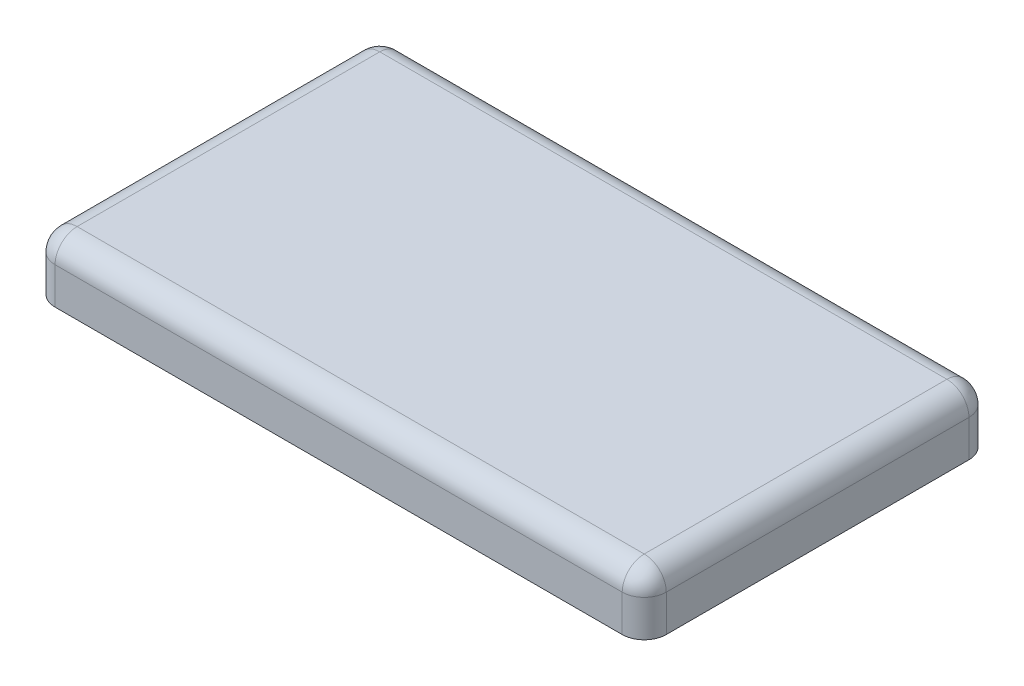
ISO-10303-21;
HEADER;
FILE_DESCRIPTION(('STEP AP214'),'2;1');
FILE_NAME('part.step','',(''),(''),'','','');
FILE_SCHEMA(('AUTOMOTIVE_DESIGN { 1 0 10303 214 1 1 1 1 }'));
ENDSEC;
DATA;
#1=APPLICATION_CONTEXT('core data for automotive mechanical design processes');
#2=APPLICATION_PROTOCOL_DEFINITION('international standard','automotive_design',2000,#1);
#3=PRODUCT_CONTEXT('',#1,'mechanical');
#4=PRODUCT('Part','Part','',(#3));
#5=PRODUCT_RELATED_PRODUCT_CATEGORY('part','',(#4));
#6=PRODUCT_DEFINITION_FORMATION('','',#4);
#7=PRODUCT_DEFINITION_CONTEXT('part definition',#1,'design');
#8=PRODUCT_DEFINITION('design','',#6,#7);
#9=PRODUCT_DEFINITION_SHAPE('','',#8);
#10=(LENGTH_UNIT() NAMED_UNIT(*) SI_UNIT(.MILLI.,.METRE.));
#11=(NAMED_UNIT(*) PLANE_ANGLE_UNIT() SI_UNIT($,.RADIAN.));
#12=(NAMED_UNIT(*) SI_UNIT($,.STERADIAN.) SOLID_ANGLE_UNIT());
#13=UNCERTAINTY_MEASURE_WITH_UNIT(LENGTH_MEASURE(1.E-05),#10,'distance_accuracy_value','');
#14=(GEOMETRIC_REPRESENTATION_CONTEXT(3) GLOBAL_UNCERTAINTY_ASSIGNED_CONTEXT((#13)) GLOBAL_UNIT_ASSIGNED_CONTEXT((#10,
#11,#12)) REPRESENTATION_CONTEXT('',''));
#15=CARTESIAN_POINT('',(0.,0.,0.));
#16=DIRECTION('',(0.,0.,1.));
#17=DIRECTION('',(1.,0.,0.));
#18=AXIS2_PLACEMENT_3D('',#15,#16,#17);
#19=CARTESIAN_POINT('',(0.,4.,0.));
#20=DIRECTION('',(1.,0.,0.));
#21=DIRECTION('',(0.,0.,-1.));
#22=AXIS2_PLACEMENT_3D('',#19,#20,#21);
#23=PLANE('',#22);
#24=DIRECTION('',(0.,0.,1.));
#25=VECTOR('',#24,1.);
#26=CARTESIAN_POINT('',(0.,0.,0.));
#27=LINE('',#26,#25);
#28=CARTESIAN_POINT('',(0.,0.,-22.1));
#29=VERTEX_POINT('',#28);
#30=CARTESIAN_POINT('',(0.,0.,-1.5));
#31=VERTEX_POINT('',#30);
#32=EDGE_CURVE('E176',#29,#31,#27,.T.);
#33=ORIENTED_EDGE('',*,*,#32,.T.);
#34=DIRECTION('',(0.,-1.,0.));
#35=VECTOR('',#34,1.);
#36=CARTESIAN_POINT('',(0.,4.,-1.5));
#37=LINE('',#36,#35);
#38=CARTESIAN_POINT('',(0.,2.5,-1.5));
#39=VERTEX_POINT('',#38);
#40=EDGE_CURVE('E52',#31,#39,#37,.F.);
#41=ORIENTED_EDGE('',*,*,#40,.T.);
#42=DIRECTION('',(0.,0.,1.));
#43=VECTOR('',#42,1.);
#44=CARTESIAN_POINT('',(0.,2.5,0.));
#45=LINE('',#44,#43);
#46=CARTESIAN_POINT('',(0.,2.5,-22.1));
#47=VERTEX_POINT('',#46);
#48=EDGE_CURVE('E57',#39,#47,#45,.F.);
#49=ORIENTED_EDGE('',*,*,#48,.T.);
#50=DIRECTION('',(0.,-1.,0.));
#51=VECTOR('',#50,1.);
#52=CARTESIAN_POINT('',(0.,4.,-22.1));
#53=LINE('',#52,#51);
#54=EDGE_CURVE('E218',#47,#29,#53,.T.);
#55=ORIENTED_EDGE('',*,*,#54,.T.);
#56=EDGE_LOOP('',(#33,#41,#49,#55));
#57=FACE_BOUND('',#56,.T.);
#58=ADVANCED_FACE('F35',(#57),#23,.F.);
#59=CARTESIAN_POINT('',(0.,4.,0.));
#60=DIRECTION('',(0.,0.,-1.));
#61=DIRECTION('',(-1.,0.,0.));
#62=AXIS2_PLACEMENT_3D('',#59,#60,#61);
#63=PLANE('',#62);
#64=DIRECTION('',(1.,0.,0.));
#65=VECTOR('',#64,1.);
#66=CARTESIAN_POINT('',(0.,2.5,0.));
#67=LINE('',#66,#65);
#68=CARTESIAN_POINT('',(40.1,2.5,0.));
#69=VERTEX_POINT('',#68);
#70=CARTESIAN_POINT('',(1.5,2.5,0.));
#71=VERTEX_POINT('',#70);
#72=EDGE_CURVE('E214',#69,#71,#67,.F.);
#73=ORIENTED_EDGE('',*,*,#72,.T.);
#74=DIRECTION('',(0.,-1.,0.));
#75=VECTOR('',#74,1.);
#76=CARTESIAN_POINT('',(1.5,4.,0.));
#77=LINE('',#76,#75);
#78=CARTESIAN_POINT('',(1.5,0.,0.));
#79=VERTEX_POINT('',#78);
#80=EDGE_CURVE('E216',#71,#79,#77,.T.);
#81=ORIENTED_EDGE('',*,*,#80,.T.);
#82=DIRECTION('',(1.,0.,0.));
#83=VECTOR('',#82,1.);
#84=CARTESIAN_POINT('',(0.,0.,0.));
#85=LINE('',#84,#83);
#86=CARTESIAN_POINT('',(40.1,0.,0.));
#87=VERTEX_POINT('',#86);
#88=EDGE_CURVE('E181',#79,#87,#85,.T.);
#89=ORIENTED_EDGE('',*,*,#88,.T.);
#90=DIRECTION('',(0.,-1.,0.));
#91=VECTOR('',#90,1.);
#92=CARTESIAN_POINT('',(40.1,4.,0.));
#93=LINE('',#92,#91);
#94=EDGE_CURVE('E212',#87,#69,#93,.F.);
#95=ORIENTED_EDGE('',*,*,#94,.T.);
#96=EDGE_LOOP('',(#73,#81,#89,#95));
#97=FACE_BOUND('',#96,.T.);
#98=ADVANCED_FACE('F283',(#97),#63,.F.);
#99=CARTESIAN_POINT('',(41.6,4.,0.));
#100=DIRECTION('',(-1.,0.,0.));
#101=DIRECTION('',(0.,0.,1.));
#102=AXIS2_PLACEMENT_3D('',#99,#100,#101);
#103=PLANE('',#102);
#104=DIRECTION('',(0.,0.,-1.));
#105=VECTOR('',#104,1.);
#106=CARTESIAN_POINT('',(41.6,0.,0.));
#107=LINE('',#106,#105);
#108=CARTESIAN_POINT('',(41.6,0.,-1.5));
#109=VERTEX_POINT('',#108);
#110=CARTESIAN_POINT('',(41.6,0.,-22.1));
#111=VERTEX_POINT('',#110);
#112=EDGE_CURVE('E184',#109,#111,#107,.T.);
#113=ORIENTED_EDGE('',*,*,#112,.T.);
#114=DIRECTION('',(0.,-1.,0.));
#115=VECTOR('',#114,1.);
#116=CARTESIAN_POINT('',(41.6,4.,-22.1));
#117=LINE('',#116,#115);
#118=CARTESIAN_POINT('',(41.6,2.5,-22.1));
#119=VERTEX_POINT('',#118);
#120=EDGE_CURVE('E210',#111,#119,#117,.F.);
#121=ORIENTED_EDGE('',*,*,#120,.T.);
#122=DIRECTION('',(0.,0.,-1.));
#123=VECTOR('',#122,1.);
#124=CARTESIAN_POINT('',(41.6,2.5,0.));
#125=LINE('',#124,#123);
#126=CARTESIAN_POINT('',(41.6,2.5,-1.5));
#127=VERTEX_POINT('',#126);
#128=EDGE_CURVE('E208',#119,#127,#125,.F.);
#129=ORIENTED_EDGE('',*,*,#128,.T.);
#130=DIRECTION('',(0.,-1.,0.));
#131=VECTOR('',#130,1.);
#132=CARTESIAN_POINT('',(41.6,4.,-1.5));
#133=LINE('',#132,#131);
#134=EDGE_CURVE('E206',#127,#109,#133,.T.);
#135=ORIENTED_EDGE('',*,*,#134,.T.);
#136=EDGE_LOOP('',(#113,#121,#129,#135));
#137=FACE_BOUND('',#136,.T.);
#138=ADVANCED_FACE('F316',(#137),#103,.F.);
#139=CARTESIAN_POINT('',(0.,4.,-23.6));
#140=DIRECTION('',(0.,0.,1.));
#141=DIRECTION('',(1.,0.,0.));
#142=AXIS2_PLACEMENT_3D('',#139,#140,#141);
#143=PLANE('',#142);
#144=DIRECTION('',(-1.,0.,0.));
#145=VECTOR('',#144,1.);
#146=CARTESIAN_POINT('',(0.,0.,-23.6));
#147=LINE('',#146,#145);
#148=CARTESIAN_POINT('',(40.1,0.,-23.6));
#149=VERTEX_POINT('',#148);
#150=CARTESIAN_POINT('',(1.49999999999999,0.,-23.6));
#151=VERTEX_POINT('',#150);
#152=EDGE_CURVE('E187',#149,#151,#147,.T.);
#153=ORIENTED_EDGE('',*,*,#152,.T.);
#154=DIRECTION('',(0.,-1.,0.));
#155=VECTOR('',#154,1.);
#156=CARTESIAN_POINT('',(1.49999999999999,4.,-23.6));
#157=LINE('',#156,#155);
#158=CARTESIAN_POINT('',(1.49999999999999,2.5,-23.6));
#159=VERTEX_POINT('',#158);
#160=EDGE_CURVE('E204',#151,#159,#157,.F.);
#161=ORIENTED_EDGE('',*,*,#160,.T.);
#162=DIRECTION('',(-1.,0.,0.));
#163=VECTOR('',#162,1.);
#164=CARTESIAN_POINT('',(0.,2.5,-23.6));
#165=LINE('',#164,#163);
#166=CARTESIAN_POINT('',(40.1,2.5,-23.6));
#167=VERTEX_POINT('',#166);
#168=EDGE_CURVE('E201',#159,#167,#165,.F.);
#169=ORIENTED_EDGE('',*,*,#168,.T.);
#170=DIRECTION('',(0.,-1.,0.));
#171=VECTOR('',#170,1.);
#172=CARTESIAN_POINT('',(40.1,4.,-23.6));
#173=LINE('',#172,#171);
#174=EDGE_CURVE('E199',#167,#149,#173,.T.);
#175=ORIENTED_EDGE('',*,*,#174,.T.);
#176=EDGE_LOOP('',(#153,#161,#169,#175));
#177=FACE_BOUND('',#176,.T.);
#178=ADVANCED_FACE('F307',(#177),#143,.F.);
#179=CARTESIAN_POINT('',(0.,4.,0.));
#180=DIRECTION('',(0.,-1.,0.));
#181=DIRECTION('',(0.,0.,-1.));
#182=AXIS2_PLACEMENT_3D('',#179,#180,#181);
#183=PLANE('',#182);
#184=DIRECTION('',(0.,0.,-1.));
#185=VECTOR('',#184,1.);
#186=CARTESIAN_POINT('',(40.1,4.,0.));
#187=LINE('',#186,#185);
#188=CARTESIAN_POINT('',(40.1,4.,-1.5));
#189=VERTEX_POINT('',#188);
#190=CARTESIAN_POINT('',(40.1,4.,-22.1));
#191=VERTEX_POINT('',#190);
#192=EDGE_CURVE('E194',#189,#191,#187,.T.);
#193=ORIENTED_EDGE('',*,*,#192,.T.);
#194=DIRECTION('',(-1.,0.,0.));
#195=VECTOR('',#194,1.);
#196=CARTESIAN_POINT('',(0.,4.,-22.1));
#197=LINE('',#196,#195);
#198=CARTESIAN_POINT('',(1.49999999999999,4.,-22.1));
#199=VERTEX_POINT('',#198);
#200=EDGE_CURVE('E196',#191,#199,#197,.T.);
#201=ORIENTED_EDGE('',*,*,#200,.T.);
#202=DIRECTION('',(0.,0.,1.));
#203=VECTOR('',#202,1.);
#204=CARTESIAN_POINT('',(1.5,4.,0.));
#205=LINE('',#204,#203);
#206=CARTESIAN_POINT('',(1.5,4.,-1.5));
#207=VERTEX_POINT('',#206);
#208=EDGE_CURVE('E190',#199,#207,#205,.T.);
#209=ORIENTED_EDGE('',*,*,#208,.T.);
#210=DIRECTION('',(1.,0.,0.));
#211=VECTOR('',#210,1.);
#212=CARTESIAN_POINT('',(0.,4.,-1.5));
#213=LINE('',#212,#211);
#214=EDGE_CURVE('E192',#207,#189,#213,.T.);
#215=ORIENTED_EDGE('',*,*,#214,.T.);
#216=EDGE_LOOP('',(#193,#201,#209,#215));
#217=FACE_BOUND('',#216,.T.);
#218=ADVANCED_FACE('F273',(#217),#183,.F.);
#219=CARTESIAN_POINT('',(0.,0.,0.));
#220=DIRECTION('',(0.,-1.,0.));
#221=DIRECTION('',(0.,0.,-1.));
#222=AXIS2_PLACEMENT_3D('',#219,#220,#221);
#223=PLANE('',#222);
#224=DIRECTION('',(0.,0.,1.));
#225=VECTOR('',#224,1.);
#226=CARTESIAN_POINT('',(40.3,0.,-22.3));
#227=LINE('',#226,#225);
#228=CARTESIAN_POINT('',(40.3,0.,-22.3));
#229=VERTEX_POINT('',#228);
#230=CARTESIAN_POINT('',(40.3,0.,-1.3));
#231=VERTEX_POINT('',#230);
#232=EDGE_CURVE('E144',#229,#231,#227,.T.);
#233=ORIENTED_EDGE('',*,*,#232,.F.);
#234=DIRECTION('',(1.,0.,0.));
#235=VECTOR('',#234,1.);
#236=CARTESIAN_POINT('',(1.29999999999999,0.,-22.3));
#237=LINE('',#236,#235);
#238=CARTESIAN_POINT('',(1.29999999999999,0.,-22.3));
#239=VERTEX_POINT('',#238);
#240=EDGE_CURVE('E161',#239,#229,#237,.T.);
#241=ORIENTED_EDGE('',*,*,#240,.F.);
#242=DIRECTION('',(0.,0.,-1.));
#243=VECTOR('',#242,1.);
#244=CARTESIAN_POINT('',(1.29999999999999,0.,-22.3));
#245=LINE('',#244,#243);
#246=CARTESIAN_POINT('',(1.29999999999999,0.,-1.3));
#247=VERTEX_POINT('',#246);
#248=EDGE_CURVE('E164',#247,#239,#245,.T.);
#249=ORIENTED_EDGE('',*,*,#248,.F.);
#250=DIRECTION('',(-1.,0.,0.));
#251=VECTOR('',#250,1.);
#252=CARTESIAN_POINT('',(1.29999999999999,0.,-1.3));
#253=LINE('',#252,#251);
#254=EDGE_CURVE('E170',#231,#247,#253,.T.);
#255=ORIENTED_EDGE('',*,*,#254,.F.);
#256=EDGE_LOOP('',(#233,#241,#249,#255));
#257=FACE_BOUND('',#256,.T.);
#258=ORIENTED_EDGE('',*,*,#88,.F.);
#259=CARTESIAN_POINT('',(1.5,0.,-1.5));
#260=DIRECTION('',(0.,-1.,0.));
#261=DIRECTION('',(0.,0.,-1.));
#262=AXIS2_PLACEMENT_3D('',#259,#260,#261);
#263=CIRCLE('',#262,1.5);
#264=EDGE_CURVE('E11',#79,#31,#263,.T.);
#265=ORIENTED_EDGE('',*,*,#264,.T.);
#266=ORIENTED_EDGE('',*,*,#32,.F.);
#267=CARTESIAN_POINT('',(1.49999999999999,0.,-22.1));
#268=DIRECTION('',(0.,-1.,0.));
#269=DIRECTION('',(0.,0.,-1.));
#270=AXIS2_PLACEMENT_3D('',#267,#268,#269);
#271=CIRCLE('',#270,1.5);
#272=EDGE_CURVE('E44',#29,#151,#271,.T.);
#273=ORIENTED_EDGE('',*,*,#272,.T.);
#274=ORIENTED_EDGE('',*,*,#152,.F.);
#275=CARTESIAN_POINT('',(40.1,0.,-22.1));
#276=DIRECTION('',(0.,-1.,0.));
#277=DIRECTION('',(0.,0.,-1.));
#278=AXIS2_PLACEMENT_3D('',#275,#276,#277);
#279=CIRCLE('',#278,1.5);
#280=EDGE_CURVE('E224',#149,#111,#279,.T.);
#281=ORIENTED_EDGE('',*,*,#280,.T.);
#282=ORIENTED_EDGE('',*,*,#112,.F.);
#283=CARTESIAN_POINT('',(40.1,0.,-1.5));
#284=DIRECTION('',(0.,-1.,0.));
#285=DIRECTION('',(0.,0.,-1.));
#286=AXIS2_PLACEMENT_3D('',#283,#284,#285);
#287=CIRCLE('',#286,1.5);
#288=EDGE_CURVE('E222',#109,#87,#287,.T.);
#289=ORIENTED_EDGE('',*,*,#288,.T.);
#290=EDGE_LOOP('',(#258,#265,#266,#273,#274,#281,#282,#289));
#291=FACE_BOUND('',#290,.T.);
#292=ADVANCED_FACE('F291',(#257,#291),#223,.T.);
#293=CARTESIAN_POINT('',(40.3,2.6,-22.3));
#294=DIRECTION('',(1.,0.,0.));
#295=DIRECTION('',(0.,0.,-1.));
#296=AXIS2_PLACEMENT_3D('',#293,#294,#295);
#297=PLANE('',#296);
#298=ORIENTED_EDGE('',*,*,#232,.T.);
#299=DIRECTION('',(0.,-1.,0.));
#300=VECTOR('',#299,1.);
#301=CARTESIAN_POINT('',(40.3,2.6,-1.3));
#302=LINE('',#301,#300);
#303=CARTESIAN_POINT('',(40.3,2.6,-1.3));
#304=VERTEX_POINT('',#303);
#305=EDGE_CURVE('E137',#304,#231,#302,.T.);
#306=ORIENTED_EDGE('',*,*,#305,.F.);
#307=DIRECTION('',(0.,0.,1.));
#308=VECTOR('',#307,1.);
#309=CARTESIAN_POINT('',(40.3,2.6,-22.3));
#310=LINE('',#309,#308);
#311=CARTESIAN_POINT('',(40.3,2.6,-22.3));
#312=VERTEX_POINT('',#311);
#313=EDGE_CURVE('E141',#312,#304,#310,.T.);
#314=ORIENTED_EDGE('',*,*,#313,.F.);
#315=DIRECTION('',(0.,-1.,0.));
#316=VECTOR('',#315,1.);
#317=CARTESIAN_POINT('',(40.3,2.6,-22.3));
#318=LINE('',#317,#316);
#319=EDGE_CURVE('E174',#312,#229,#318,.T.);
#320=ORIENTED_EDGE('',*,*,#319,.T.);
#321=EDGE_LOOP('',(#298,#306,#314,#320));
#322=FACE_BOUND('',#321,.T.);
#323=ADVANCED_FACE('F139',(#322),#297,.F.);
#324=CARTESIAN_POINT('',(1.29999999999999,2.6,-22.3));
#325=DIRECTION('',(0.,0.,-1.));
#326=DIRECTION('',(-1.,0.,0.));
#327=AXIS2_PLACEMENT_3D('',#324,#325,#326);
#328=PLANE('',#327);
#329=ORIENTED_EDGE('',*,*,#240,.T.);
#330=ORIENTED_EDGE('',*,*,#319,.F.);
#331=DIRECTION('',(1.,0.,0.));
#332=VECTOR('',#331,1.);
#333=CARTESIAN_POINT('',(1.29999999999999,2.6,-22.3));
#334=LINE('',#333,#332);
#335=CARTESIAN_POINT('',(1.29999999999999,2.6,-22.3));
#336=VERTEX_POINT('',#335);
#337=EDGE_CURVE('E149',#336,#312,#334,.T.);
#338=ORIENTED_EDGE('',*,*,#337,.F.);
#339=DIRECTION('',(0.,-1.,0.));
#340=VECTOR('',#339,1.);
#341=CARTESIAN_POINT('',(1.29999999999999,2.6,-22.3));
#342=LINE('',#341,#340);
#343=EDGE_CURVE('E177',#336,#239,#342,.T.);
#344=ORIENTED_EDGE('',*,*,#343,.T.);
#345=EDGE_LOOP('',(#329,#330,#338,#344));
#346=FACE_BOUND('',#345,.T.);
#347=ADVANCED_FACE('F445',(#346),#328,.F.);
#348=CARTESIAN_POINT('',(1.29999999999999,2.6,-22.3));
#349=DIRECTION('',(-1.,0.,0.));
#350=DIRECTION('',(0.,0.,1.));
#351=AXIS2_PLACEMENT_3D('',#348,#349,#350);
#352=PLANE('',#351);
#353=ORIENTED_EDGE('',*,*,#248,.T.);
#354=ORIENTED_EDGE('',*,*,#343,.F.);
#355=DIRECTION('',(0.,0.,-1.));
#356=VECTOR('',#355,1.);
#357=CARTESIAN_POINT('',(1.29999999999999,2.6,-22.3));
#358=LINE('',#357,#356);
#359=CARTESIAN_POINT('',(1.29999999999999,2.6,-1.3));
#360=VERTEX_POINT('',#359);
#361=EDGE_CURVE('E157',#360,#336,#358,.T.);
#362=ORIENTED_EDGE('',*,*,#361,.F.);
#363=DIRECTION('',(0.,-1.,0.));
#364=VECTOR('',#363,1.);
#365=CARTESIAN_POINT('',(1.29999999999999,2.6,-1.3));
#366=LINE('',#365,#364);
#367=EDGE_CURVE('E148',#360,#247,#366,.T.);
#368=ORIENTED_EDGE('',*,*,#367,.T.);
#369=EDGE_LOOP('',(#353,#354,#362,#368));
#370=FACE_BOUND('',#369,.T.);
#371=ADVANCED_FACE('F437',(#370),#352,.F.);
#372=CARTESIAN_POINT('',(1.29999999999999,2.6,-1.3));
#373=DIRECTION('',(0.,0.,1.));
#374=DIRECTION('',(1.,0.,0.));
#375=AXIS2_PLACEMENT_3D('',#372,#373,#374);
#376=PLANE('',#375);
#377=ORIENTED_EDGE('',*,*,#254,.T.);
#378=ORIENTED_EDGE('',*,*,#367,.F.);
#379=DIRECTION('',(-1.,0.,0.));
#380=VECTOR('',#379,1.);
#381=CARTESIAN_POINT('',(1.29999999999999,2.6,-1.3));
#382=LINE('',#381,#380);
#383=EDGE_CURVE('E152',#304,#360,#382,.T.);
#384=ORIENTED_EDGE('',*,*,#383,.F.);
#385=ORIENTED_EDGE('',*,*,#305,.T.);
#386=EDGE_LOOP('',(#377,#378,#384,#385));
#387=FACE_BOUND('',#386,.T.);
#388=ADVANCED_FACE('F153',(#387),#376,.F.);
#389=CARTESIAN_POINT('',(0.,2.6,0.));
#390=DIRECTION('',(0.,1.,0.));
#391=DIRECTION('',(0.,0.,1.));
#392=AXIS2_PLACEMENT_3D('',#389,#390,#391);
#393=PLANE('',#392);
#394=ORIENTED_EDGE('',*,*,#313,.T.);
#395=ORIENTED_EDGE('',*,*,#383,.T.);
#396=ORIENTED_EDGE('',*,*,#361,.T.);
#397=ORIENTED_EDGE('',*,*,#337,.T.);
#398=EDGE_LOOP('',(#394,#395,#396,#397));
#399=FACE_BOUND('',#398,.T.);
#400=ADVANCED_FACE('F159',(#399),#393,.F.);
#401=CARTESIAN_POINT('',(40.1,4.,-1.5));
#402=DIRECTION('',(0.,-1.,0.));
#403=DIRECTION('',(0.,0.,-1.));
#404=AXIS2_PLACEMENT_3D('',#401,#402,#403);
#405=CYLINDRICAL_SURFACE('',#404,1.5);
#406=ORIENTED_EDGE('',*,*,#288,.F.);
#407=ORIENTED_EDGE('',*,*,#134,.F.);
#408=CARTESIAN_POINT('',(40.1,2.5,-1.5));
#409=DIRECTION('',(0.,1.,0.));
#410=DIRECTION('',(0.,0.,1.));
#411=AXIS2_PLACEMENT_3D('',#408,#409,#410);
#412=CIRCLE('',#411,1.5);
#413=EDGE_CURVE('E39',#69,#127,#412,.T.);
#414=ORIENTED_EDGE('',*,*,#413,.F.);
#415=ORIENTED_EDGE('',*,*,#94,.F.);
#416=EDGE_LOOP('',(#406,#407,#414,#415));
#417=FACE_BOUND('',#416,.T.);
#418=ADVANCED_FACE('F37',(#417),#405,.T.);
#419=CARTESIAN_POINT('',(0.,2.5,-1.5));
#420=DIRECTION('',(1.,0.,0.));
#421=DIRECTION('',(0.,0.,-1.));
#422=AXIS2_PLACEMENT_3D('',#419,#420,#421);
#423=CYLINDRICAL_SURFACE('',#422,1.5);
#424=CARTESIAN_POINT('',(1.5,2.5,-1.5));
#425=DIRECTION('',(-1.,0.,0.));
#426=DIRECTION('',(0.,0.,1.));
#427=AXIS2_PLACEMENT_3D('',#424,#425,#426);
#428=CIRCLE('',#427,1.5);
#429=EDGE_CURVE('E252',#71,#207,#428,.T.);
#430=ORIENTED_EDGE('',*,*,#429,.F.);
#431=ORIENTED_EDGE('',*,*,#72,.F.);
#432=CARTESIAN_POINT('',(40.1,2.5,-1.5));
#433=DIRECTION('',(1.,0.,0.));
#434=DIRECTION('',(0.,0.,-1.));
#435=AXIS2_PLACEMENT_3D('',#432,#433,#434);
#436=CIRCLE('',#435,1.5);
#437=EDGE_CURVE('E254',#189,#69,#436,.T.);
#438=ORIENTED_EDGE('',*,*,#437,.F.);
#439=ORIENTED_EDGE('',*,*,#214,.F.);
#440=EDGE_LOOP('',(#430,#431,#438,#439));
#441=FACE_BOUND('',#440,.T.);
#442=ADVANCED_FACE('F280',(#441),#423,.T.);
#443=CARTESIAN_POINT('',(1.5,4.,-1.5));
#444=DIRECTION('',(0.,-1.,0.));
#445=DIRECTION('',(0.,0.,-1.));
#446=AXIS2_PLACEMENT_3D('',#443,#444,#445);
#447=CYLINDRICAL_SURFACE('',#446,1.5);
#448=ORIENTED_EDGE('',*,*,#264,.F.);
#449=ORIENTED_EDGE('',*,*,#80,.F.);
#450=CARTESIAN_POINT('',(1.5,2.5,-1.5));
#451=DIRECTION('',(0.,1.,0.));
#452=DIRECTION('',(0.,0.,1.));
#453=AXIS2_PLACEMENT_3D('',#450,#451,#452);
#454=CIRCLE('',#453,1.5);
#455=EDGE_CURVE('E249',#39,#71,#454,.T.);
#456=ORIENTED_EDGE('',*,*,#455,.F.);
#457=ORIENTED_EDGE('',*,*,#40,.F.);
#458=EDGE_LOOP('',(#448,#449,#456,#457));
#459=FACE_BOUND('',#458,.T.);
#460=ADVANCED_FACE('F287',(#459),#447,.T.);
#461=CARTESIAN_POINT('',(40.1,2.5,-1.5));
#462=DIRECTION('',(0.,0.,1.));
#463=DIRECTION('',(1.,0.,0.));
#464=AXIS2_PLACEMENT_3D('',#461,#462,#463);
#465=SPHERICAL_SURFACE('',#464,1.5);
#466=ORIENTED_EDGE('',*,*,#437,.T.);
#467=ORIENTED_EDGE('',*,*,#413,.T.);
#468=CARTESIAN_POINT('',(40.1,2.5,-1.5));
#469=DIRECTION('',(0.,0.,1.));
#470=DIRECTION('',(1.,0.,0.));
#471=AXIS2_PLACEMENT_3D('',#468,#469,#470);
#472=CIRCLE('',#471,1.5);
#473=EDGE_CURVE('E246',#189,#127,#472,.F.);
#474=ORIENTED_EDGE('',*,*,#473,.F.);
#475=EDGE_LOOP('',(#466,#467,#474));
#476=FACE_BOUND('',#475,.T.);
#477=ADVANCED_FACE('F261',(#476),#465,.T.);
#478=CARTESIAN_POINT('',(1.5,2.5,-1.5));
#479=DIRECTION('',(0.,0.,1.));
#480=DIRECTION('',(1.,0.,0.));
#481=AXIS2_PLACEMENT_3D('',#478,#479,#480);
#482=SPHERICAL_SURFACE('',#481,1.5);
#483=ORIENTED_EDGE('',*,*,#455,.T.);
#484=ORIENTED_EDGE('',*,*,#429,.T.);
#485=CARTESIAN_POINT('',(1.5,2.5,-1.5));
#486=DIRECTION('',(0.,0.,1.));
#487=DIRECTION('',(1.,0.,0.));
#488=AXIS2_PLACEMENT_3D('',#485,#486,#487);
#489=CIRCLE('',#488,1.5);
#490=EDGE_CURVE('E243',#39,#207,#489,.F.);
#491=ORIENTED_EDGE('',*,*,#490,.F.);
#492=EDGE_LOOP('',(#483,#484,#491));
#493=FACE_BOUND('',#492,.T.);
#494=ADVANCED_FACE('F348',(#493),#482,.T.);
#495=CARTESIAN_POINT('',(40.1,4.,-22.1));
#496=DIRECTION('',(0.,-1.,0.));
#497=DIRECTION('',(0.,0.,-1.));
#498=AXIS2_PLACEMENT_3D('',#495,#496,#497);
#499=CYLINDRICAL_SURFACE('',#498,1.5);
#500=ORIENTED_EDGE('',*,*,#280,.F.);
#501=ORIENTED_EDGE('',*,*,#174,.F.);
#502=CARTESIAN_POINT('',(40.1,2.5,-22.1));
#503=DIRECTION('',(0.,1.,0.));
#504=DIRECTION('',(0.,0.,1.));
#505=AXIS2_PLACEMENT_3D('',#502,#503,#504);
#506=CIRCLE('',#505,1.5);
#507=EDGE_CURVE('E240',#119,#167,#506,.T.);
#508=ORIENTED_EDGE('',*,*,#507,.F.);
#509=ORIENTED_EDGE('',*,*,#120,.F.);
#510=EDGE_LOOP('',(#500,#501,#508,#509));
#511=FACE_BOUND('',#510,.T.);
#512=ADVANCED_FACE('F314',(#511),#499,.T.);
#513=CARTESIAN_POINT('',(40.1,2.5,0.));
#514=DIRECTION('',(0.,0.,-1.));
#515=DIRECTION('',(-1.,0.,0.));
#516=AXIS2_PLACEMENT_3D('',#513,#514,#515);
#517=CYLINDRICAL_SURFACE('',#516,1.5);
#518=ORIENTED_EDGE('',*,*,#473,.T.);
#519=ORIENTED_EDGE('',*,*,#128,.F.);
#520=CARTESIAN_POINT('',(40.1,2.5,-22.1));
#521=DIRECTION('',(0.,0.,-1.));
#522=DIRECTION('',(-1.,0.,0.));
#523=AXIS2_PLACEMENT_3D('',#520,#521,#522);
#524=CIRCLE('',#523,1.5);
#525=EDGE_CURVE('E237',#191,#119,#524,.T.);
#526=ORIENTED_EDGE('',*,*,#525,.F.);
#527=ORIENTED_EDGE('',*,*,#192,.F.);
#528=EDGE_LOOP('',(#518,#519,#526,#527));
#529=FACE_BOUND('',#528,.T.);
#530=ADVANCED_FACE('F268',(#529),#517,.T.);
#531=CARTESIAN_POINT('',(1.5,2.5,0.));
#532=DIRECTION('',(0.,0.,1.));
#533=DIRECTION('',(1.,0.,0.));
#534=AXIS2_PLACEMENT_3D('',#531,#532,#533);
#535=CYLINDRICAL_SURFACE('',#534,1.5);
#536=ORIENTED_EDGE('',*,*,#490,.T.);
#537=ORIENTED_EDGE('',*,*,#208,.F.);
#538=CARTESIAN_POINT('',(1.49999999999999,2.5,-22.1));
#539=DIRECTION('',(0.,0.,-1.));
#540=DIRECTION('',(-1.,0.,0.));
#541=AXIS2_PLACEMENT_3D('',#538,#539,#540);
#542=CIRCLE('',#541,1.5);
#543=EDGE_CURVE('E234',#47,#199,#542,.T.);
#544=ORIENTED_EDGE('',*,*,#543,.F.);
#545=ORIENTED_EDGE('',*,*,#48,.F.);
#546=EDGE_LOOP('',(#536,#537,#544,#545));
#547=FACE_BOUND('',#546,.T.);
#548=ADVANCED_FACE('F300',(#547),#535,.T.);
#549=CARTESIAN_POINT('',(1.49999999999999,4.,-22.1));
#550=DIRECTION('',(0.,-1.,0.));
#551=DIRECTION('',(0.,0.,-1.));
#552=AXIS2_PLACEMENT_3D('',#549,#550,#551);
#553=CYLINDRICAL_SURFACE('',#552,1.5);
#554=ORIENTED_EDGE('',*,*,#272,.F.);
#555=ORIENTED_EDGE('',*,*,#54,.F.);
#556=CARTESIAN_POINT('',(1.49999999999999,2.5,-22.1));
#557=DIRECTION('',(0.,1.,0.));
#558=DIRECTION('',(0.,0.,1.));
#559=AXIS2_PLACEMENT_3D('',#556,#557,#558);
#560=CIRCLE('',#559,1.5);
#561=EDGE_CURVE('E231',#159,#47,#560,.T.);
#562=ORIENTED_EDGE('',*,*,#561,.F.);
#563=ORIENTED_EDGE('',*,*,#160,.F.);
#564=EDGE_LOOP('',(#554,#555,#562,#563));
#565=FACE_BOUND('',#564,.T.);
#566=ADVANCED_FACE('F296',(#565),#553,.T.);
#567=CARTESIAN_POINT('',(40.1,2.5,-22.1));
#568=DIRECTION('',(0.,0.,1.));
#569=DIRECTION('',(1.,0.,0.));
#570=AXIS2_PLACEMENT_3D('',#567,#568,#569);
#571=SPHERICAL_SURFACE('',#570,1.5);
#572=ORIENTED_EDGE('',*,*,#525,.T.);
#573=ORIENTED_EDGE('',*,*,#507,.T.);
#574=CARTESIAN_POINT('',(40.1,2.5,-22.1));
#575=DIRECTION('',(1.,0.,0.));
#576=DIRECTION('',(0.,0.,-1.));
#577=AXIS2_PLACEMENT_3D('',#574,#575,#576);
#578=CIRCLE('',#577,1.5);
#579=EDGE_CURVE('E229',#191,#167,#578,.F.);
#580=ORIENTED_EDGE('',*,*,#579,.F.);
#581=EDGE_LOOP('',(#572,#573,#580));
#582=FACE_BOUND('',#581,.T.);
#583=ADVANCED_FACE('F336',(#582),#571,.T.);
#584=CARTESIAN_POINT('',(1.49999999999999,2.5,-22.1));
#585=DIRECTION('',(0.,0.,1.));
#586=DIRECTION('',(1.,0.,0.));
#587=AXIS2_PLACEMENT_3D('',#584,#585,#586);
#588=SPHERICAL_SURFACE('',#587,1.5);
#589=ORIENTED_EDGE('',*,*,#561,.T.);
#590=ORIENTED_EDGE('',*,*,#543,.T.);
#591=CARTESIAN_POINT('',(1.49999999999999,2.5,-22.1));
#592=DIRECTION('',(-1.,0.,0.));
#593=DIRECTION('',(0.,0.,1.));
#594=AXIS2_PLACEMENT_3D('',#591,#592,#593);
#595=CIRCLE('',#594,1.5);
#596=EDGE_CURVE('E227',#159,#199,#595,.F.);
#597=ORIENTED_EDGE('',*,*,#596,.F.);
#598=EDGE_LOOP('',(#589,#590,#597));
#599=FACE_BOUND('',#598,.T.);
#600=ADVANCED_FACE('F303',(#599),#588,.T.);
#601=CARTESIAN_POINT('',(0.,2.5,-22.1));
#602=DIRECTION('',(-1.,0.,0.));
#603=DIRECTION('',(0.,0.,1.));
#604=AXIS2_PLACEMENT_3D('',#601,#602,#603);
#605=CYLINDRICAL_SURFACE('',#604,1.5);
#606=ORIENTED_EDGE('',*,*,#579,.T.);
#607=ORIENTED_EDGE('',*,*,#168,.F.);
#608=ORIENTED_EDGE('',*,*,#596,.T.);
#609=ORIENTED_EDGE('',*,*,#200,.F.);
#610=EDGE_LOOP('',(#606,#607,#608,#609));
#611=FACE_BOUND('',#610,.T.);
#612=ADVANCED_FACE('F305',(#611),#605,.T.);
#613=CLOSED_SHELL('',(#58,#98,#138,#178,#218,#292,#323,#347,#371,#388,#400,#418,#442,#460,#477,
#494,#512,#530,#548,#566,#583,#600,#612));
#614=MANIFOLD_SOLID_BREP('B2',#613);
#615=ADVANCED_BREP_SHAPE_REPRESENTATION('',(#18,#614),#14);
#616=SHAPE_DEFINITION_REPRESENTATION(#9,#615);
ENDSEC;
END-ISO-10303-21;
